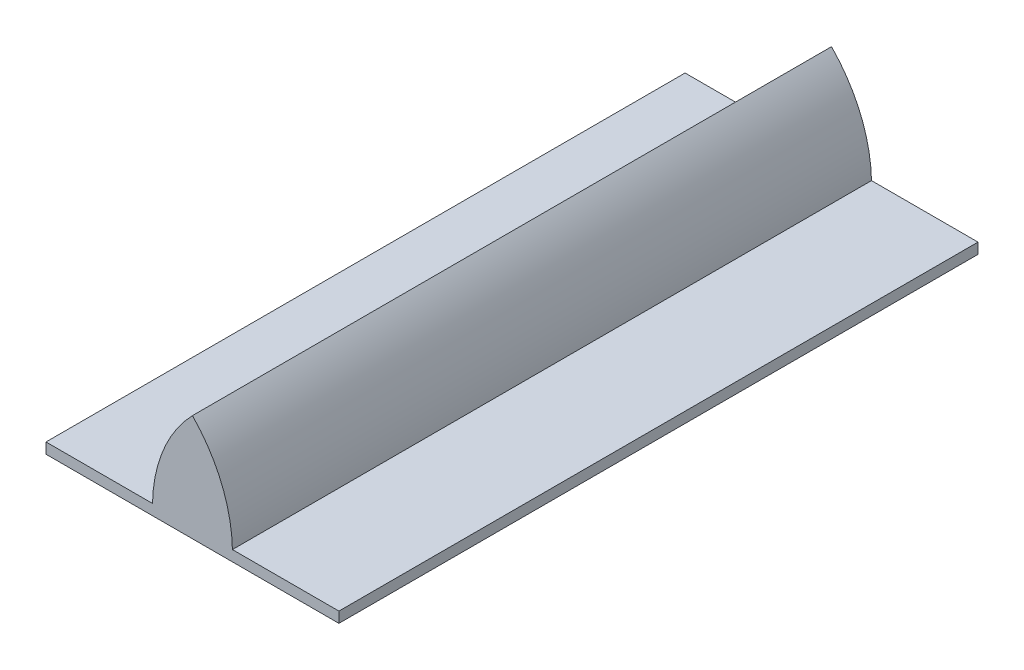
ISO-10303-21;
HEADER;
FILE_DESCRIPTION(('STEP AP214'),'2;1');
FILE_NAME('part.step','',(''),(''),'','','');
FILE_SCHEMA(('AUTOMOTIVE_DESIGN { 1 0 10303 214 1 1 1 1 }'));
ENDSEC;
DATA;
#1=APPLICATION_CONTEXT('core data for automotive mechanical design processes');
#2=APPLICATION_PROTOCOL_DEFINITION('international standard','automotive_design',2000,#1);
#3=PRODUCT_CONTEXT('',#1,'mechanical');
#4=PRODUCT('Part','Part','',(#3));
#5=PRODUCT_RELATED_PRODUCT_CATEGORY('part','',(#4));
#6=PRODUCT_DEFINITION_FORMATION('','',#4);
#7=PRODUCT_DEFINITION_CONTEXT('part definition',#1,'design');
#8=PRODUCT_DEFINITION('design','',#6,#7);
#9=PRODUCT_DEFINITION_SHAPE('','',#8);
#10=(LENGTH_UNIT() NAMED_UNIT(*) SI_UNIT(.MILLI.,.METRE.));
#11=(NAMED_UNIT(*) PLANE_ANGLE_UNIT() SI_UNIT($,.RADIAN.));
#12=(NAMED_UNIT(*) SI_UNIT($,.STERADIAN.) SOLID_ANGLE_UNIT());
#13=UNCERTAINTY_MEASURE_WITH_UNIT(LENGTH_MEASURE(1.E-05),#10,'distance_accuracy_value','');
#14=(GEOMETRIC_REPRESENTATION_CONTEXT(3) GLOBAL_UNCERTAINTY_ASSIGNED_CONTEXT((#13)) GLOBAL_UNIT_ASSIGNED_CONTEXT((#10,
#11,#12)) REPRESENTATION_CONTEXT('',''));
#15=CARTESIAN_POINT('',(0.,0.,0.));
#16=DIRECTION('',(0.,0.,1.));
#17=DIRECTION('',(1.,0.,0.));
#18=AXIS2_PLACEMENT_3D('',#15,#16,#17);
#19=CARTESIAN_POINT('',(-242.510598524552,0.,762.));
#20=DIRECTION('',(0.,0.,-1.));
#21=DIRECTION('',(-1.,0.,0.));
#22=AXIS2_PLACEMENT_3D('',#19,#20,#21);
#23=CYLINDRICAL_SURFACE('',#22,168.91);
#24=CARTESIAN_POINT('',(-242.510598524552,0.,0.));
#25=DIRECTION('',(0.,0.,1.));
#26=DIRECTION('',(1.,0.,0.));
#27=AXIS2_PLACEMENT_3D('',#24,#25,#26);
#28=CIRCLE('',#27,168.91);
#29=CARTESIAN_POINT('',(-73.6285104503131,3.07057448777707,0.));
#30=VERTEX_POINT('',#29);
#31=CARTESIAN_POINT('',(-121.255299262276,117.591413380467,0.));
#32=VERTEX_POINT('',#31);
#33=EDGE_CURVE('E121',#30,#32,#28,.T.);
#34=ORIENTED_EDGE('',*,*,#33,.T.);
#35=DIRECTION('',(0.,0.,-1.));
#36=VECTOR('',#35,1.);
#37=CARTESIAN_POINT('',(-121.255299262276,117.591413380467,762.));
#38=LINE('',#37,#36);
#39=CARTESIAN_POINT('',(-121.255299262276,117.591413380467,762.));
#40=VERTEX_POINT('',#39);
#41=EDGE_CURVE('E11',#40,#32,#38,.T.);
#42=ORIENTED_EDGE('',*,*,#41,.F.);
#43=CARTESIAN_POINT('',(-242.510598524552,0.,762.));
#44=DIRECTION('',(0.,0.,1.));
#45=DIRECTION('',(1.,0.,0.));
#46=AXIS2_PLACEMENT_3D('',#43,#44,#45);
#47=CIRCLE('',#46,168.91);
#48=CARTESIAN_POINT('',(-73.6285104503131,3.07057448777707,762.));
#49=VERTEX_POINT('',#48);
#50=EDGE_CURVE('E134',#49,#40,#47,.T.);
#51=ORIENTED_EDGE('',*,*,#50,.F.);
#52=DIRECTION('',(0.,0.,-1.));
#53=VECTOR('',#52,1.);
#54=CARTESIAN_POINT('',(-73.6285104503131,3.07057448777707,762.));
#55=LINE('',#54,#53);
#56=EDGE_CURVE('E117',#49,#30,#55,.T.);
#57=ORIENTED_EDGE('',*,*,#56,.T.);
#58=EDGE_LOOP('',(#34,#42,#51,#57));
#59=FACE_BOUND('',#58,.T.);
#60=ADVANCED_FACE('F32',(#59),#23,.T.);
#61=CARTESIAN_POINT('',(0.,0.,762.));
#62=DIRECTION('',(0.,0.,-1.));
#63=DIRECTION('',(-1.,0.,0.));
#64=AXIS2_PLACEMENT_3D('',#61,#62,#63);
#65=CYLINDRICAL_SURFACE('',#64,168.91);
#66=CARTESIAN_POINT('',(0.,0.,0.));
#67=DIRECTION('',(0.,0.,1.));
#68=DIRECTION('',(-1.,0.,0.));
#69=AXIS2_PLACEMENT_3D('',#66,#67,#68);
#70=CIRCLE('',#69,168.91);
#71=CARTESIAN_POINT('',(-168.882088074239,3.07057448777707,0.));
#72=VERTEX_POINT('',#71);
#73=EDGE_CURVE('E124',#32,#72,#70,.T.);
#74=ORIENTED_EDGE('',*,*,#73,.T.);
#75=DIRECTION('',(0.,0.,-1.));
#76=VECTOR('',#75,1.);
#77=CARTESIAN_POINT('',(-168.882088074239,3.07057448777707,762.));
#78=LINE('',#77,#76);
#79=CARTESIAN_POINT('',(-168.882088074239,3.07057448777707,762.));
#80=VERTEX_POINT('',#79);
#81=EDGE_CURVE('E40',#80,#72,#78,.T.);
#82=ORIENTED_EDGE('',*,*,#81,.F.);
#83=CARTESIAN_POINT('',(0.,0.,762.));
#84=DIRECTION('',(0.,0.,1.));
#85=DIRECTION('',(-1.,0.,0.));
#86=AXIS2_PLACEMENT_3D('',#83,#84,#85);
#87=CIRCLE('',#86,168.91);
#88=EDGE_CURVE('E88',#40,#80,#87,.T.);
#89=ORIENTED_EDGE('',*,*,#88,.F.);
#90=ORIENTED_EDGE('',*,*,#41,.T.);
#91=EDGE_LOOP('',(#74,#82,#89,#90));
#92=FACE_BOUND('',#91,.T.);
#93=ADVANCED_FACE('F159',(#92),#65,.T.);
#94=CARTESIAN_POINT('',(-295.882088074239,3.07057448777707,762.));
#95=DIRECTION('',(0.,-1.,0.));
#96=DIRECTION('',(0.,0.,-1.));
#97=AXIS2_PLACEMENT_3D('',#94,#95,#96);
#98=PLANE('',#97);
#99=DIRECTION('',(-1.,0.,0.));
#100=VECTOR('',#99,1.);
#101=CARTESIAN_POINT('',(-295.882088074239,3.07057448777707,0.));
#102=LINE('',#101,#100);
#103=CARTESIAN_POINT('',(-295.882088074239,3.07057448777707,0.));
#104=VERTEX_POINT('',#103);
#105=EDGE_CURVE('E126',#72,#104,#102,.T.);
#106=ORIENTED_EDGE('',*,*,#105,.T.);
#107=DIRECTION('',(0.,0.,-1.));
#108=VECTOR('',#107,1.);
#109=CARTESIAN_POINT('',(-295.882088074239,3.07057448777707,762.));
#110=LINE('',#109,#108);
#111=CARTESIAN_POINT('',(-295.882088074239,3.07057448777707,762.));
#112=VERTEX_POINT('',#111);
#113=EDGE_CURVE('E138',#112,#104,#110,.T.);
#114=ORIENTED_EDGE('',*,*,#113,.F.);
#115=DIRECTION('',(-1.,0.,0.));
#116=VECTOR('',#115,1.);
#117=CARTESIAN_POINT('',(-295.882088074239,3.07057448777707,762.));
#118=LINE('',#117,#116);
#119=EDGE_CURVE('E146',#80,#112,#118,.T.);
#120=ORIENTED_EDGE('',*,*,#119,.F.);
#121=ORIENTED_EDGE('',*,*,#81,.T.);
#122=EDGE_LOOP('',(#106,#114,#120,#121));
#123=FACE_BOUND('',#122,.T.);
#124=ADVANCED_FACE('F144',(#123),#98,.F.);
#125=CARTESIAN_POINT('',(-295.882088074239,-9.62942551222293,762.));
#126=DIRECTION('',(1.,0.,0.));
#127=DIRECTION('',(0.,0.,-1.));
#128=AXIS2_PLACEMENT_3D('',#125,#126,#127);
#129=PLANE('',#128);
#130=DIRECTION('',(0.,-1.,0.));
#131=VECTOR('',#130,1.);
#132=CARTESIAN_POINT('',(-295.882088074239,-9.62942551222293,0.));
#133=LINE('',#132,#131);
#134=CARTESIAN_POINT('',(-295.882088074239,-9.62942551222293,0.));
#135=VERTEX_POINT('',#134);
#136=EDGE_CURVE('E128',#104,#135,#133,.T.);
#137=ORIENTED_EDGE('',*,*,#136,.T.);
#138=DIRECTION('',(0.,0.,-1.));
#139=VECTOR('',#138,1.);
#140=CARTESIAN_POINT('',(-295.882088074239,-9.62942551222293,762.));
#141=LINE('',#140,#139);
#142=CARTESIAN_POINT('',(-295.882088074239,-9.62942551222293,762.));
#143=VERTEX_POINT('',#142);
#144=EDGE_CURVE('E112',#143,#135,#141,.T.);
#145=ORIENTED_EDGE('',*,*,#144,.F.);
#146=DIRECTION('',(0.,-1.,0.));
#147=VECTOR('',#146,1.);
#148=CARTESIAN_POINT('',(-295.882088074239,-9.62942551222293,762.));
#149=LINE('',#148,#147);
#150=EDGE_CURVE('E104',#112,#143,#149,.T.);
#151=ORIENTED_EDGE('',*,*,#150,.F.);
#152=ORIENTED_EDGE('',*,*,#113,.T.);
#153=EDGE_LOOP('',(#137,#145,#151,#152));
#154=FACE_BOUND('',#153,.T.);
#155=ADVANCED_FACE('F152',(#154),#129,.F.);
#156=CARTESIAN_POINT('',(53.371489549687,-9.62942551222289,762.));
#157=DIRECTION('',(0.,1.,0.));
#158=DIRECTION('',(-1.,0.,0.));
#159=AXIS2_PLACEMENT_3D('',#156,#157,#158);
#160=PLANE('',#159);
#161=DIRECTION('',(1.,0.,0.));
#162=VECTOR('',#161,1.);
#163=CARTESIAN_POINT('',(53.371489549687,-9.62942551222289,0.));
#164=LINE('',#163,#162);
#165=CARTESIAN_POINT('',(53.371489549687,-9.62942551222289,0.));
#166=VERTEX_POINT('',#165);
#167=EDGE_CURVE('E111',#135,#166,#164,.T.);
#168=ORIENTED_EDGE('',*,*,#167,.T.);
#169=DIRECTION('',(0.,0.,-1.));
#170=VECTOR('',#169,1.);
#171=CARTESIAN_POINT('',(53.371489549687,-9.62942551222289,762.));
#172=LINE('',#171,#170);
#173=CARTESIAN_POINT('',(53.371489549687,-9.62942551222289,762.));
#174=VERTEX_POINT('',#173);
#175=EDGE_CURVE('E109',#174,#166,#172,.T.);
#176=ORIENTED_EDGE('',*,*,#175,.F.);
#177=DIRECTION('',(1.,0.,0.));
#178=VECTOR('',#177,1.);
#179=CARTESIAN_POINT('',(-295.882088074239,-9.62942551222293,762.));
#180=LINE('',#179,#178);
#181=EDGE_CURVE('E98',#143,#174,#180,.T.);
#182=ORIENTED_EDGE('',*,*,#181,.F.);
#183=ORIENTED_EDGE('',*,*,#144,.T.);
#184=EDGE_LOOP('',(#168,#176,#182,#183));
#185=FACE_BOUND('',#184,.T.);
#186=ADVANCED_FACE('F110',(#185),#160,.F.);
#187=CARTESIAN_POINT('',(53.371489549687,-9.62942551222289,762.));
#188=DIRECTION('',(-1.,0.,0.));
#189=DIRECTION('',(0.,-1.,0.));
#190=AXIS2_PLACEMENT_3D('',#187,#188,#189);
#191=PLANE('',#190);
#192=DIRECTION('',(0.,1.,0.));
#193=VECTOR('',#192,1.);
#194=CARTESIAN_POINT('',(53.371489549687,-9.62942551222289,0.));
#195=LINE('',#194,#193);
#196=CARTESIAN_POINT('',(53.3714895496869,3.07057448777707,0.));
#197=VERTEX_POINT('',#196);
#198=EDGE_CURVE('E74',#166,#197,#195,.T.);
#199=ORIENTED_EDGE('',*,*,#198,.T.);
#200=DIRECTION('',(0.,0.,-1.));
#201=VECTOR('',#200,1.);
#202=CARTESIAN_POINT('',(53.3714895496869,3.07057448777707,762.));
#203=LINE('',#202,#201);
#204=CARTESIAN_POINT('',(53.3714895496869,3.07057448777707,762.));
#205=VERTEX_POINT('',#204);
#206=EDGE_CURVE('E113',#205,#197,#203,.T.);
#207=ORIENTED_EDGE('',*,*,#206,.F.);
#208=DIRECTION('',(0.,1.,0.));
#209=VECTOR('',#208,1.);
#210=CARTESIAN_POINT('',(53.371489549687,-9.62942551222289,762.));
#211=LINE('',#210,#209);
#212=EDGE_CURVE('E102',#174,#205,#211,.T.);
#213=ORIENTED_EDGE('',*,*,#212,.F.);
#214=ORIENTED_EDGE('',*,*,#175,.T.);
#215=EDGE_LOOP('',(#199,#207,#213,#214));
#216=FACE_BOUND('',#215,.T.);
#217=ADVANCED_FACE('F115',(#216),#191,.F.);
#218=CARTESIAN_POINT('',(53.3714895496869,3.07057448777707,762.));
#219=DIRECTION('',(0.,-1.,0.));
#220=DIRECTION('',(0.,0.,-1.));
#221=AXIS2_PLACEMENT_3D('',#218,#219,#220);
#222=PLANE('',#221);
#223=DIRECTION('',(-1.,0.,0.));
#224=VECTOR('',#223,1.);
#225=CARTESIAN_POINT('',(53.3714895496869,3.07057448777707,0.));
#226=LINE('',#225,#224);
#227=EDGE_CURVE('E80',#197,#30,#226,.T.);
#228=ORIENTED_EDGE('',*,*,#227,.T.);
#229=ORIENTED_EDGE('',*,*,#56,.F.);
#230=DIRECTION('',(-1.,0.,0.));
#231=VECTOR('',#230,1.);
#232=CARTESIAN_POINT('',(53.3714895496869,3.07057448777707,762.));
#233=LINE('',#232,#231);
#234=EDGE_CURVE('E48',#205,#49,#233,.T.);
#235=ORIENTED_EDGE('',*,*,#234,.F.);
#236=ORIENTED_EDGE('',*,*,#206,.T.);
#237=EDGE_LOOP('',(#228,#229,#235,#236));
#238=FACE_BOUND('',#237,.T.);
#239=ADVANCED_FACE('F173',(#238),#222,.F.);
#240=CARTESIAN_POINT('',(-242.510598524552,0.,762.));
#241=DIRECTION('',(0.,0.,1.));
#242=DIRECTION('',(1.,0.,0.));
#243=AXIS2_PLACEMENT_3D('',#240,#241,#242);
#244=PLANE('',#243);
#245=ORIENTED_EDGE('',*,*,#50,.T.);
#246=ORIENTED_EDGE('',*,*,#88,.T.);
#247=ORIENTED_EDGE('',*,*,#119,.T.);
#248=ORIENTED_EDGE('',*,*,#150,.T.);
#249=ORIENTED_EDGE('',*,*,#181,.T.);
#250=ORIENTED_EDGE('',*,*,#212,.T.);
#251=ORIENTED_EDGE('',*,*,#234,.T.);
#252=EDGE_LOOP('',(#245,#246,#247,#248,#249,#250,#251));
#253=FACE_BOUND('',#252,.T.);
#254=ADVANCED_FACE('F100',(#253),#244,.T.);
#255=CARTESIAN_POINT('',(-242.510598524552,0.,0.));
#256=DIRECTION('',(0.,0.,1.));
#257=DIRECTION('',(1.,0.,0.));
#258=AXIS2_PLACEMENT_3D('',#255,#256,#257);
#259=PLANE('',#258);
#260=ORIENTED_EDGE('',*,*,#33,.F.);
#261=ORIENTED_EDGE('',*,*,#227,.F.);
#262=ORIENTED_EDGE('',*,*,#198,.F.);
#263=ORIENTED_EDGE('',*,*,#167,.F.);
#264=ORIENTED_EDGE('',*,*,#136,.F.);
#265=ORIENTED_EDGE('',*,*,#105,.F.);
#266=ORIENTED_EDGE('',*,*,#73,.F.);
#267=EDGE_LOOP('',(#260,#261,#262,#263,#264,#265,#266));
#268=FACE_BOUND('',#267,.T.);
#269=ADVANCED_FACE('F150',(#268),#259,.F.);
#270=CLOSED_SHELL('',(#60,#93,#124,#155,#186,#217,#239,#254,#269));
#271=MANIFOLD_SOLID_BREP('B2',#270);
#272=ADVANCED_BREP_SHAPE_REPRESENTATION('',(#18,#271),#14);
#273=SHAPE_DEFINITION_REPRESENTATION(#9,#272);
ENDSEC;
END-ISO-10303-21;
